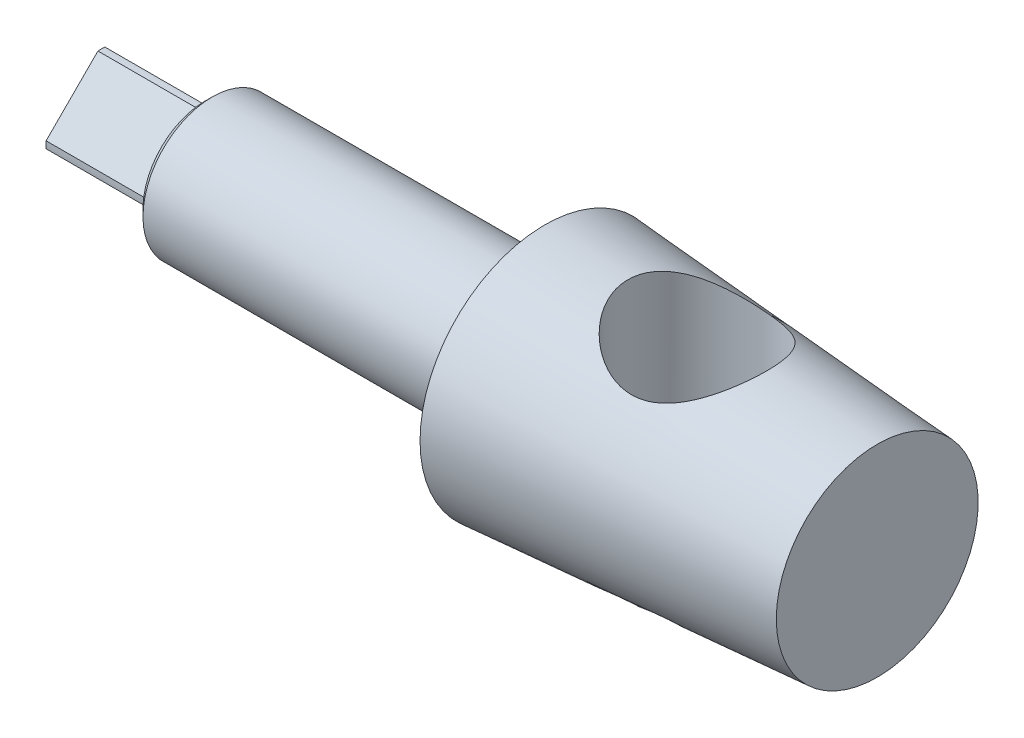
ISO-10303-21;
HEADER;
FILE_DESCRIPTION(('STEP AP214'),'2;1');
FILE_NAME('part.step','',(''),(''),'','','');
FILE_SCHEMA(('AUTOMOTIVE_DESIGN { 1 0 10303 214 1 1 1 1 }'));
ENDSEC;
DATA;
#1=APPLICATION_CONTEXT('core data for automotive mechanical design processes');
#2=APPLICATION_PROTOCOL_DEFINITION('international standard','automotive_design',2000,#1);
#3=PRODUCT_CONTEXT('',#1,'mechanical');
#4=PRODUCT('Part','Part','',(#3));
#5=PRODUCT_RELATED_PRODUCT_CATEGORY('part','',(#4));
#6=PRODUCT_DEFINITION_FORMATION('','',#4);
#7=PRODUCT_DEFINITION_CONTEXT('part definition',#1,'design');
#8=PRODUCT_DEFINITION('design','',#6,#7);
#9=PRODUCT_DEFINITION_SHAPE('','',#8);
#10=(LENGTH_UNIT() NAMED_UNIT(*) SI_UNIT(.MILLI.,.METRE.));
#11=(NAMED_UNIT(*) PLANE_ANGLE_UNIT() SI_UNIT($,.RADIAN.));
#12=(NAMED_UNIT(*) SI_UNIT($,.STERADIAN.) SOLID_ANGLE_UNIT());
#13=UNCERTAINTY_MEASURE_WITH_UNIT(LENGTH_MEASURE(1.E-05),#10,'distance_accuracy_value','');
#14=(GEOMETRIC_REPRESENTATION_CONTEXT(3) GLOBAL_UNCERTAINTY_ASSIGNED_CONTEXT((#13)) GLOBAL_UNIT_ASSIGNED_CONTEXT((#10,
#11,#12)) REPRESENTATION_CONTEXT('',''));
#15=CARTESIAN_POINT('',(0.,0.,0.));
#16=DIRECTION('',(0.,0.,1.));
#17=DIRECTION('',(1.,0.,0.));
#18=AXIS2_PLACEMENT_3D('',#15,#16,#17);
#19=CARTESIAN_POINT('',(-64.,0.,0.));
#20=DIRECTION('',(1.,0.,0.));
#21=DIRECTION('',(0.,0.,-1.));
#22=AXIS2_PLACEMENT_3D('',#19,#20,#21);
#23=PLANE('',#22);
#24=DIRECTION('',(0.,-0.707106781186547,-0.707106781186548));
#25=VECTOR('',#24,1.);
#26=CARTESIAN_POINT('',(-64.,0.,-8.48528137423857));
#27=LINE('',#26,#25);
#28=CARTESIAN_POINT('',(-64.,7.98429807389323,-0.500983300345341));
#29=VERTEX_POINT('',#28);
#30=CARTESIAN_POINT('',(-64.,0.500983300345344,-7.98429807389323));
#31=VERTEX_POINT('',#30);
#32=EDGE_CURVE('E166',#29,#31,#27,.T.);
#33=ORIENTED_EDGE('',*,*,#32,.T.);
#34=CARTESIAN_POINT('',(-64.,0.,0.));
#35=DIRECTION('',(-1.,0.,0.));
#36=DIRECTION('',(0.,0.,1.));
#37=AXIS2_PLACEMENT_3D('',#34,#35,#36);
#38=CIRCLE('',#37,8.);
#39=CARTESIAN_POINT('',(-64.,-0.500983300345339,-7.98429807389323));
#40=VERTEX_POINT('',#39);
#41=EDGE_CURVE('E186',#31,#40,#38,.T.);
#42=ORIENTED_EDGE('',*,*,#41,.T.);
#43=DIRECTION('',(0.,-0.707106781186548,0.707106781186547));
#44=VECTOR('',#43,1.);
#45=CARTESIAN_POINT('',(-64.,0.,-8.48528137423857));
#46=LINE('',#45,#44);
#47=CARTESIAN_POINT('',(-64.,-7.98429807389323,-0.500983300345344));
#48=VERTEX_POINT('',#47);
#49=EDGE_CURVE('E111',#40,#48,#46,.T.);
#50=ORIENTED_EDGE('',*,*,#49,.T.);
#51=CARTESIAN_POINT('',(-64.,-7.98429807389323,0.500983300345345));
#52=VERTEX_POINT('',#51);
#53=EDGE_CURVE('E130',#48,#52,#38,.T.);
#54=ORIENTED_EDGE('',*,*,#53,.T.);
#55=DIRECTION('',(0.,0.707106781186547,0.707106781186548));
#56=VECTOR('',#55,1.);
#57=CARTESIAN_POINT('',(-64.,-8.48528137423857,0.));
#58=LINE('',#57,#56);
#59=CARTESIAN_POINT('',(-64.,-0.500983300345346,7.98429807389323));
#60=VERTEX_POINT('',#59);
#61=EDGE_CURVE('E172',#52,#60,#58,.T.);
#62=ORIENTED_EDGE('',*,*,#61,.T.);
#63=CARTESIAN_POINT('',(-64.,0.500983300345345,7.98429807389323));
#64=VERTEX_POINT('',#63);
#65=EDGE_CURVE('E125',#60,#64,#38,.T.);
#66=ORIENTED_EDGE('',*,*,#65,.T.);
#67=DIRECTION('',(0.,0.707106781186548,-0.707106781186547));
#68=VECTOR('',#67,1.);
#69=CARTESIAN_POINT('',(-64.,8.48528137423857,0.));
#70=LINE('',#69,#68);
#71=CARTESIAN_POINT('',(-64.,7.98429807389323,0.500983300345347));
#72=VERTEX_POINT('',#71);
#73=EDGE_CURVE('E169',#64,#72,#70,.T.);
#74=ORIENTED_EDGE('',*,*,#73,.T.);
#75=EDGE_CURVE('E120',#72,#29,#38,.T.);
#76=ORIENTED_EDGE('',*,*,#75,.T.);
#77=EDGE_LOOP('',(#33,#42,#50,#54,#62,#66,#74,#76));
#78=FACE_BOUND('',#77,.T.);
#79=ADVANCED_FACE('F37',(#78),#23,.F.);
#80=CARTESIAN_POINT('',(-69.9935805331268,0.,0.));
#81=DIRECTION('',(-1.,0.,0.));
#82=DIRECTION('',(0.,0.,1.));
#83=AXIS2_PLACEMENT_3D('',#80,#81,#82);
#84=CYLINDRICAL_SURFACE('',#83,8.);
#85=DIRECTION('',(-1.,0.,0.));
#86=VECTOR('',#85,1.);
#87=CARTESIAN_POINT('',(-69.9935805331268,0.500983300345343,-7.98429807389323));
#88=LINE('',#87,#86);
#89=CARTESIAN_POINT('',(-49.,0.500983300345342,-7.98429807389323));
#90=VERTEX_POINT('',#89);
#91=EDGE_CURVE('E150',#90,#31,#88,.T.);
#92=ORIENTED_EDGE('',*,*,#91,.F.);
#93=CARTESIAN_POINT('',(-49.,0.,0.));
#94=DIRECTION('',(-1.,0.,0.));
#95=DIRECTION('',(0.,0.,1.));
#96=AXIS2_PLACEMENT_3D('',#93,#94,#95);
#97=CIRCLE('',#96,8.);
#98=CARTESIAN_POINT('',(-49.,-0.50098330034534,-7.98429807389323));
#99=VERTEX_POINT('',#98);
#100=EDGE_CURVE('E126',#90,#99,#97,.T.);
#101=ORIENTED_EDGE('',*,*,#100,.T.);
#102=DIRECTION('',(-1.,0.,0.));
#103=VECTOR('',#102,1.);
#104=CARTESIAN_POINT('',(-69.9935805331268,-0.500983300345337,-7.98429807389323));
#105=LINE('',#104,#103);
#106=EDGE_CURVE('E161',#40,#99,#105,.F.);
#107=ORIENTED_EDGE('',*,*,#106,.F.);
#108=ORIENTED_EDGE('',*,*,#41,.F.);
#109=EDGE_LOOP('',(#92,#101,#107,#108));
#110=FACE_BOUND('',#109,.T.);
#111=ADVANCED_FACE('F219',(#110),#84,.T.);
#112=DIRECTION('',(-1.,0.,0.));
#113=VECTOR('',#112,1.);
#114=CARTESIAN_POINT('',(-69.9935805331268,7.98429807389323,-0.500983300345341));
#115=LINE('',#114,#113);
#116=CARTESIAN_POINT('',(-49.,7.98429807389323,-0.500983300345341));
#117=VERTEX_POINT('',#116);
#118=EDGE_CURVE('E121',#29,#117,#115,.F.);
#119=ORIENTED_EDGE('',*,*,#118,.F.);
#120=ORIENTED_EDGE('',*,*,#75,.F.);
#121=DIRECTION('',(-1.,0.,0.));
#122=VECTOR('',#121,1.);
#123=CARTESIAN_POINT('',(-69.9935805331268,7.98429807389323,0.500983300345347));
#124=LINE('',#123,#122);
#125=CARTESIAN_POINT('',(-49.,7.98429807389323,0.500983300345346));
#126=VERTEX_POINT('',#125);
#127=EDGE_CURVE('E104',#126,#72,#124,.T.);
#128=ORIENTED_EDGE('',*,*,#127,.F.);
#129=EDGE_CURVE('E118',#126,#117,#97,.T.);
#130=ORIENTED_EDGE('',*,*,#129,.T.);
#131=EDGE_LOOP('',(#119,#120,#128,#130));
#132=FACE_BOUND('',#131,.T.);
#133=ADVANCED_FACE('F117',(#132),#84,.T.);
#134=DIRECTION('',(-1.,0.,0.));
#135=VECTOR('',#134,1.);
#136=CARTESIAN_POINT('',(-69.9935805331268,0.500983300345345,7.98429807389323));
#137=LINE('',#136,#135);
#138=CARTESIAN_POINT('',(-49.,0.500983300345344,7.98429807389323));
#139=VERTEX_POINT('',#138);
#140=EDGE_CURVE('E107',#64,#139,#137,.F.);
#141=ORIENTED_EDGE('',*,*,#140,.F.);
#142=ORIENTED_EDGE('',*,*,#65,.F.);
#143=DIRECTION('',(-1.,0.,0.));
#144=VECTOR('',#143,1.);
#145=CARTESIAN_POINT('',(-69.9935805331268,-0.500983300345343,7.98429807389323));
#146=LINE('',#145,#144);
#147=CARTESIAN_POINT('',(-49.,-0.500983300345344,7.98429807389323));
#148=VERTEX_POINT('',#147);
#149=EDGE_CURVE('E155',#148,#60,#146,.T.);
#150=ORIENTED_EDGE('',*,*,#149,.F.);
#151=EDGE_CURVE('E128',#148,#139,#97,.T.);
#152=ORIENTED_EDGE('',*,*,#151,.T.);
#153=EDGE_LOOP('',(#141,#142,#150,#152));
#154=FACE_BOUND('',#153,.T.);
#155=ADVANCED_FACE('F177',(#154),#84,.T.);
#156=DIRECTION('',(-1.,0.,0.));
#157=VECTOR('',#156,1.);
#158=CARTESIAN_POINT('',(-69.9935805331268,-7.98429807389323,0.500983300345343));
#159=LINE('',#158,#157);
#160=CARTESIAN_POINT('',(-49.,-7.98429807389323,0.500983300345345));
#161=VERTEX_POINT('',#160);
#162=EDGE_CURVE('E157',#52,#161,#159,.F.);
#163=ORIENTED_EDGE('',*,*,#162,.F.);
#164=ORIENTED_EDGE('',*,*,#53,.F.);
#165=DIRECTION('',(-1.,0.,0.));
#166=VECTOR('',#165,1.);
#167=CARTESIAN_POINT('',(-69.9935805331268,-7.98429807389323,-0.500983300345341));
#168=LINE('',#167,#166);
#169=CARTESIAN_POINT('',(-49.,-7.98429807389323,-0.500983300345342));
#170=VERTEX_POINT('',#169);
#171=EDGE_CURVE('E159',#170,#48,#168,.T.);
#172=ORIENTED_EDGE('',*,*,#171,.F.);
#173=EDGE_CURVE('E133',#170,#161,#97,.T.);
#174=ORIENTED_EDGE('',*,*,#173,.T.);
#175=EDGE_LOOP('',(#163,#164,#172,#174));
#176=FACE_BOUND('',#175,.T.);
#177=ADVANCED_FACE('F225',(#176),#84,.T.);
#178=CARTESIAN_POINT('',(-49.,8.,0.));
#179=DIRECTION('',(1.,0.,0.));
#180=DIRECTION('',(0.,0.,-1.));
#181=AXIS2_PLACEMENT_3D('',#178,#179,#180);
#182=PLANE('',#181);
#183=CARTESIAN_POINT('',(-49.,0.,0.));
#184=DIRECTION('',(1.,0.,0.));
#185=DIRECTION('',(0.,0.,-1.));
#186=AXIS2_PLACEMENT_3D('',#183,#184,#185);
#187=CIRCLE('',#186,9.00000000000001);
#188=CARTESIAN_POINT('',(-49.,0.,-9.00000000000001));
#189=VERTEX_POINT('',#188);
#190=EDGE_CURVE('E45',#189,#189,#187,.F.);
#191=ORIENTED_EDGE('',*,*,#190,.T.);
#192=EDGE_LOOP('',(#191));
#193=FACE_BOUND('',#192,.T.);
#194=ORIENTED_EDGE('',*,*,#100,.F.);
#195=DIRECTION('',(0.,-0.707106781186547,-0.707106781186548));
#196=VECTOR('',#195,1.);
#197=CARTESIAN_POINT('',(-49.,0.,-8.48528137423857));
#198=LINE('',#197,#196);
#199=EDGE_CURVE('E110',#117,#90,#198,.T.);
#200=ORIENTED_EDGE('',*,*,#199,.F.);
#201=ORIENTED_EDGE('',*,*,#129,.F.);
#202=DIRECTION('',(0.,0.707106781186548,-0.707106781186547));
#203=VECTOR('',#202,1.);
#204=CARTESIAN_POINT('',(-49.,8.48528137423857,0.));
#205=LINE('',#204,#203);
#206=EDGE_CURVE('E101',#139,#126,#205,.T.);
#207=ORIENTED_EDGE('',*,*,#206,.F.);
#208=ORIENTED_EDGE('',*,*,#151,.F.);
#209=DIRECTION('',(0.,0.707106781186548,0.707106781186548));
#210=VECTOR('',#209,1.);
#211=CARTESIAN_POINT('',(-49.,-8.48528137423857,0.));
#212=LINE('',#211,#210);
#213=EDGE_CURVE('E52',#161,#148,#212,.T.);
#214=ORIENTED_EDGE('',*,*,#213,.F.);
#215=ORIENTED_EDGE('',*,*,#173,.F.);
#216=DIRECTION('',(0.,-0.707106781186548,0.707106781186547));
#217=VECTOR('',#216,1.);
#218=CARTESIAN_POINT('',(-49.,0.,-8.48528137423857));
#219=LINE('',#218,#217);
#220=EDGE_CURVE('E58',#99,#170,#219,.T.);
#221=ORIENTED_EDGE('',*,*,#220,.F.);
#222=EDGE_LOOP('',(#194,#200,#201,#207,#208,#214,#215,#221));
#223=FACE_BOUND('',#222,.T.);
#224=ADVANCED_FACE('F123',(#193,#223),#182,.F.);
#225=CARTESIAN_POINT('',(-69.9935805331268,0.,0.));
#226=DIRECTION('',(-1.,0.,0.));
#227=DIRECTION('',(0.,0.,1.));
#228=AXIS2_PLACEMENT_3D('',#225,#226,#227);
#229=CYLINDRICAL_SURFACE('',#228,10.);
#230=CARTESIAN_POINT('',(-48.,0.,0.));
#231=DIRECTION('',(1.,0.,0.));
#232=DIRECTION('',(0.,0.,-1.));
#233=AXIS2_PLACEMENT_3D('',#230,#231,#232);
#234=CIRCLE('',#233,10.);
#235=CARTESIAN_POINT('',(-48.,0.,-10.));
#236=VERTEX_POINT('',#235);
#237=EDGE_CURVE('E12',#236,#236,#234,.T.);
#238=ORIENTED_EDGE('',*,*,#237,.T.);
#239=EDGE_LOOP('',(#238));
#240=FACE_BOUND('',#239,.T.);
#241=CARTESIAN_POINT('',(0.,0.,0.));
#242=DIRECTION('',(-1.,0.,0.));
#243=DIRECTION('',(0.,0.,1.));
#244=AXIS2_PLACEMENT_3D('',#241,#242,#243);
#245=CIRCLE('',#244,10.);
#246=CARTESIAN_POINT('',(0.,0.,10.));
#247=VERTEX_POINT('',#246);
#248=EDGE_CURVE('E135',#247,#247,#245,.T.);
#249=ORIENTED_EDGE('',*,*,#248,.T.);
#250=EDGE_LOOP('',(#249));
#251=FACE_BOUND('',#250,.T.);
#252=ADVANCED_FACE('F229',(#240,#251),#229,.T.);
#253=CARTESIAN_POINT('',(0.,10.,0.));
#254=DIRECTION('',(1.,0.,0.));
#255=DIRECTION('',(0.,0.,-1.));
#256=AXIS2_PLACEMENT_3D('',#253,#254,#255);
#257=PLANE('',#256);
#258=ORIENTED_EDGE('',*,*,#248,.F.);
#259=EDGE_LOOP('',(#258));
#260=FACE_BOUND('',#259,.T.);
#261=CARTESIAN_POINT('',(0.,0.,0.));
#262=DIRECTION('',(-1.,0.,0.));
#263=DIRECTION('',(0.,0.,1.));
#264=AXIS2_PLACEMENT_3D('',#261,#262,#263);
#265=CIRCLE('',#264,18.);
#266=CARTESIAN_POINT('',(0.,0.,18.));
#267=VERTEX_POINT('',#266);
#268=EDGE_CURVE('E140',#267,#267,#265,.T.);
#269=ORIENTED_EDGE('',*,*,#268,.T.);
#270=EDGE_LOOP('',(#269));
#271=FACE_BOUND('',#270,.T.);
#272=ADVANCED_FACE('F215',(#260,#271),#257,.F.);
#273=CARTESIAN_POINT('',(48.,0.,0.));
#274=DIRECTION('',(-1.,0.,0.));
#275=DIRECTION('',(0.,0.,1.));
#276=AXIS2_PLACEMENT_3D('',#273,#274,#275);
#277=CONICAL_SURFACE('',#276,14.5714285714289,0.0713074647852829);
#278=CARTESIAN_POINT('',(15.2980103573918,-15.1912129330623,-7.4218147935914));
#279=CARTESIAN_POINT('',(15.0956531993115,-15.2965748174476,-7.23908386618915));
#280=CARTESIAN_POINT('',(14.9005243458751,-15.4011346112845,-7.04786094383407));
#281=CARTESIAN_POINT('',(14.525688359926,-15.6065795129821,-6.64902643629856));
#282=CARTESIAN_POINT('',(14.3459808332944,-15.7074647147153,-6.44141527020893));
#283=CARTESIAN_POINT('',(14.0027379325853,-15.9037587315013,-6.00998609720935));
#284=CARTESIAN_POINT('',(13.8392365159726,-15.9991558788072,-5.78613569396557));
#285=CARTESIAN_POINT('',(13.5302069070274,-16.1822074237129,-5.32352622577979));
#286=CARTESIAN_POINT('',(13.3846691881525,-16.2698659182048,-5.08477516501451));
#287=CARTESIAN_POINT('',(13.1119546059566,-16.4361247003953,-4.59157874980465));
#288=CARTESIAN_POINT('',(12.9849135116824,-16.5146572290525,-4.33703516647278));
#289=CARTESIAN_POINT('',(12.751976679433,-16.6600252635254,-3.81519275646416));
#290=CARTESIAN_POINT('',(12.6460817931174,-16.7268602982134,-3.54789341658869));
#291=CARTESIAN_POINT('',(12.4571345284435,-16.8469589450248,-3.00279866902666));
#292=CARTESIAN_POINT('',(12.3740501719698,-16.9002415485272,-2.7250185825871));
#293=CARTESIAN_POINT('',(12.2319509046493,-16.9918091927125,-2.16096195099377));
#294=CARTESIAN_POINT('',(12.1729318497381,-17.0300968154981,-1.87468687779953));
#295=CARTESIAN_POINT('',(12.0856380430123,-17.0868802174249,-1.33111469621484));
#296=CARTESIAN_POINT('',(12.0545248494714,-17.1071990363657,-1.07446019786563));
#297=CARTESIAN_POINT('',(12.0122768000214,-17.1348136319657,-0.55881979123568));
#298=CARTESIAN_POINT('',(12.0011402539152,-17.1421105103933,-0.299834082059161));
#299=CARTESIAN_POINT('',(11.9990264007463,-17.143494656422,0.218187532211762));
#300=CARTESIAN_POINT('',(12.0080441737219,-17.1375851478939,0.477223409623876));
#301=CARTESIAN_POINT('',(12.0460814164004,-17.1127144138911,0.993182665546992));
#302=CARTESIAN_POINT('',(12.0751001997422,-17.093753636288,1.25010611624257));
#303=CARTESIAN_POINT('',(12.1492843584669,-17.0454670991561,1.73745741182321));
#304=CARTESIAN_POINT('',(12.192819558558,-17.0171903324493,1.96824073925726));
#305=CARTESIAN_POINT('',(12.2956358911478,-16.9507262544322,2.42489359360623));
#306=CARTESIAN_POINT('',(12.3549222401001,-16.9125356599641,2.65076146576395));
#307=CARTESIAN_POINT('',(12.488534818894,-16.826992389129,3.09613879042362));
#308=CARTESIAN_POINT('',(12.5628568793568,-16.7796422528473,3.31564998637391));
#309=CARTESIAN_POINT('',(12.7258126737237,-16.6766084801069,3.74736020186641));
#310=CARTESIAN_POINT('',(12.8144518781357,-16.6209216588406,3.95955638862467));
#311=CARTESIAN_POINT('',(13.0112599191234,-16.4984031739513,4.38882419847084));
#312=CARTESIAN_POINT('',(13.1203099938836,-16.4310890840547,4.60535371325547));
#313=CARTESIAN_POINT('',(13.3527304778889,-16.2892847954662,5.02821726073007));
#314=CARTESIAN_POINT('',(13.4761061194097,-16.2147919765124,5.2345475287666));
#315=CARTESIAN_POINT('',(13.7362336831301,-16.0598804214871,5.63626040334558));
#316=CARTESIAN_POINT('',(13.8729863213241,-15.9794613682748,5.83164242300942));
#317=CARTESIAN_POINT('',(14.1590267714168,-15.8139517692677,6.21092350506603));
#318=CARTESIAN_POINT('',(14.308315947471,-15.7288607154417,6.39482131400546));
#319=CARTESIAN_POINT('',(14.6423569679827,-15.5420348842188,6.77784173410317));
#320=CARTESIAN_POINT('',(14.8290443751703,-15.4397413809724,6.97500697044685));
#321=CARTESIAN_POINT('',(15.2170765294099,-15.2326207799813,7.35291186633719));
#322=CARTESIAN_POINT('',(15.4184227752476,-15.1277934238979,7.53364984202704));
#323=CARTESIAN_POINT('',(15.8352617794501,-14.9174883889471,7.87840526904642));
#324=CARTESIAN_POINT('',(16.0507765053774,-14.8120099414648,8.04239569877917));
#325=CARTESIAN_POINT('',(16.4949363358231,-14.602730303964,8.35270435227106));
#326=CARTESIAN_POINT('',(16.7235812759769,-14.4989290929706,8.49902279717773));
#327=CARTESIAN_POINT('',(17.2193733493616,-14.2840176958133,8.78845081516873));
#328=CARTESIAN_POINT('',(17.4879812191002,-14.1733698278128,8.92941349226032));
#329=CARTESIAN_POINT('',(18.0396976164262,-13.960352400777,9.18742326487725));
#330=CARTESIAN_POINT('',(18.3228087965933,-13.8579843649725,9.30446596589277));
#331=CARTESIAN_POINT('',(18.9015853406389,-13.6654377346484,9.51284430179756));
#332=CARTESIAN_POINT('',(19.1972205130446,-13.5752317989097,9.60423811525955));
#333=CARTESIAN_POINT('',(19.7997640509157,-13.4105653322726,9.75989978627841));
#334=CARTESIAN_POINT('',(20.1066664166662,-13.3360965601645,9.82418185931434));
#335=CARTESIAN_POINT('',(20.6388541393175,-13.2252640657587,9.90946123194595));
#336=CARTESIAN_POINT('',(20.8620214199694,-13.1841114670374,9.93760352662883));
#337=CARTESIAN_POINT('',(21.311443102431,-13.1126302334257,9.97881603527227));
#338=CARTESIAN_POINT('',(21.5376967559755,-13.082299021754,9.99188983898756));
#339=CARTESIAN_POINT('',(21.9916467453753,-13.0332842266043,10.0025714563892));
#340=CARTESIAN_POINT('',(22.2193417536501,-13.0145911607821,10.0001918790558));
#341=CARTESIAN_POINT('',(22.6747165460132,-12.9892288487289,9.97981462135863));
#342=CARTESIAN_POINT('',(22.9023963293284,-12.9825600082635,9.96181641396408));
#343=CARTESIAN_POINT('',(23.3560557341124,-12.9812141494413,9.91025932762101));
#344=CARTESIAN_POINT('',(23.5820350713178,-12.9865390932803,9.8766979032271));
#345=CARTESIAN_POINT('',(24.0306107619814,-13.0086973413665,9.7943160534358));
#346=CARTESIAN_POINT('',(24.2532070980483,-13.0255307047551,9.74549554962323));
#347=CARTESIAN_POINT('',(24.693664008669,-13.0698370446685,9.6330613181265));
#348=CARTESIAN_POINT('',(24.9115219164532,-13.0973158567253,9.56943948442916));
#349=CARTESIAN_POINT('',(25.341223280731,-13.1617494826834,9.42801238456329));
#350=CARTESIAN_POINT('',(25.5530642594143,-13.1987081393612,9.35020137033469));
#351=CARTESIAN_POINT('',(25.9746385221262,-13.2817208607156,9.17906521048467));
#352=CARTESIAN_POINT('',(26.1842000241427,-13.3279714353905,9.08541333587123));
#353=CARTESIAN_POINT('',(26.595124515826,-13.4274494990951,8.8846579114228));
#354=CARTESIAN_POINT('',(26.7964847868755,-13.4806792773765,8.77754994833432));
#355=CARTESIAN_POINT('',(27.1903290881653,-13.5925596514647,8.55056445072725));
#356=CARTESIAN_POINT('',(27.3828118390338,-13.6512110249611,8.43068508386352));
#357=CARTESIAN_POINT('',(27.7583625647536,-13.7724209397447,8.17877706593204));
#358=CARTESIAN_POINT('',(27.9414299142885,-13.8349797399311,8.04674760954598));
#359=CARTESIAN_POINT('',(28.3313346519812,-13.9746087346649,7.74505583660926));
#360=CARTESIAN_POINT('',(28.5361376367106,-14.0521894131756,7.57299378741918));
#361=CARTESIAN_POINT('',(28.9310271925555,-14.2085337168486,7.21333339216));
#362=CARTESIAN_POINT('',(29.1211165475132,-14.2872971148547,7.0257379989947));
#363=CARTESIAN_POINT('',(29.486073007778,-14.44397655433,6.63552158290185));
#364=CARTESIAN_POINT('',(29.6609231647878,-14.521891570112,6.43288428323817));
#365=CARTESIAN_POINT('',(29.994244794614,-14.6747368164691,6.01362993446565));
#366=CARTESIAN_POINT('',(30.1527221939742,-14.749668120997,5.7970179902896));
#367=CARTESIAN_POINT('',(30.4662784530378,-14.901376623836,5.3299507022013));
#368=CARTESIAN_POINT('',(30.6196891817361,-14.9776842465606,5.0782178105209));
#369=CARTESIAN_POINT('',(30.9045316339786,-15.1221568391553,4.56033419697584));
#370=CARTESIAN_POINT('',(31.0359616222448,-15.1903211660284,4.29418233899423));
#371=CARTESIAN_POINT('',(31.2752702141037,-15.3162861268074,3.74937339094771));
#372=CARTESIAN_POINT('',(31.3831676850806,-15.3740950565415,3.47072653657073));
#373=CARTESIAN_POINT('',(31.5740893009075,-15.4774842437146,2.90284448592311));
#374=CARTESIAN_POINT('',(31.6571172593491,-15.523066375948,2.61361092070268));
#375=CARTESIAN_POINT('',(31.7903061853179,-15.5967000171803,2.05528161801027));
#376=CARTESIAN_POINT('',(31.842858823886,-15.6260152241983,1.78692162930871));
#377=CARTESIAN_POINT('',(31.9258747632497,-15.6724917937995,1.24576239039784));
#378=CARTESIAN_POINT('',(31.9563394270255,-15.6896539063107,0.972963415166864));
#379=CARTESIAN_POINT('',(31.9947137502689,-15.7112919139428,0.425420344495721));
#380=CARTESIAN_POINT('',(32.0026348115191,-15.7157742220677,0.150677302812292));
#381=CARTESIAN_POINT('',(31.9958306002248,-15.7119302894951,-0.398429551940886));
#382=CARTESIAN_POINT('',(31.9811067438826,-15.7036048497881,-0.672793387651962));
#383=CARTESIAN_POINT('',(31.9318405837012,-15.6758701802544,-1.19141510659526));
#384=CARTESIAN_POINT('',(31.8994247442635,-15.6576511170776,-1.43594279272369));
#385=CARTESIAN_POINT('',(31.8168313878232,-15.6115065424355,-1.921026694062));
#386=CARTESIAN_POINT('',(31.7666553549586,-15.5835818420295,-2.16158323936442));
#387=CARTESIAN_POINT('',(31.6491022943962,-15.5186948848098,-2.63720357709925));
#388=CARTESIAN_POINT('',(31.5817247963065,-15.4817323808494,-2.87226721913064));
#389=CARTESIAN_POINT('',(31.4304562814489,-15.3996247013892,-3.3355480702781));
#390=CARTESIAN_POINT('',(31.3465644527031,-15.3544791235521,-3.5637649421155));
#391=CARTESIAN_POINT('',(31.1600943291091,-15.2554488445861,-4.01935057432748));
#392=CARTESIAN_POINT('',(31.0570042511948,-15.2013308429725,-4.24645882423284));
#393=CARTESIAN_POINT('',(30.8348780470406,-15.0866576467649,-4.69113301250013));
#394=CARTESIAN_POINT('',(30.715836224104,-15.0261001540984,-4.90869550485912));
#395=CARTESIAN_POINT('',(30.4626353506911,-14.8998700382129,-5.33338018162571));
#396=CARTESIAN_POINT('',(30.3284710067971,-14.8341956263902,-5.54049867331643));
#397=CARTESIAN_POINT('',(30.0458453901143,-14.6991582001458,-5.94347984180841));
#398=CARTESIAN_POINT('',(29.8973828450337,-14.6297948577195,-6.13934151446745));
#399=CARTESIAN_POINT('',(29.5678457618813,-14.4802244350922,-6.542441013002));
#400=CARTESIAN_POINT('',(29.3850043969114,-14.399730331327,-6.7481305870249));
#401=CARTESIAN_POINT('',(29.0031152934919,-14.2381810305257,-7.14366597703873));
#402=CARTESIAN_POINT('',(28.8040657310343,-14.1571257712812,-7.33351000495138));
#403=CARTESIAN_POINT('',(28.3905594675632,-13.9968130586218,-7.69652212643103));
#404=CARTESIAN_POINT('',(28.1761004346298,-13.9175558797089,-7.86968768672118));
#405=CARTESIAN_POINT('',(27.7325827259426,-13.7633802600821,-8.19839450692542));
#406=CARTESIAN_POINT('',(27.5035243582589,-13.6884617278793,-8.35393613854122));
#407=CARTESIAN_POINT('',(27.0582488336101,-13.5537061496521,-8.62987741605967));
#408=CARTESIAN_POINT('',(26.8434876319857,-13.4931206963068,-8.75226196721571));
#409=CARTESIAN_POINT('',(26.4039869457183,-13.379493885903,-8.98144080349491));
#410=CARTESIAN_POINT('',(26.1792522428496,-13.3264489637488,-9.0882424567076));
#411=CARTESIAN_POINT('',(25.7208769015482,-13.2299074711003,-9.28532441431687));
#412=CARTESIAN_POINT('',(25.4872440645305,-13.1864027525844,-9.3756188060536));
#413=CARTESIAN_POINT('',(25.012172767957,-13.1107893348441,-9.53886191211694));
#414=CARTESIAN_POINT('',(24.7707344169124,-13.0786804772704,-9.6118108674597));
#415=CARTESIAN_POINT('',(24.2798353792629,-13.0273241381194,-9.73997841021857));
#416=CARTESIAN_POINT('',(24.0303275164309,-13.0081767246157,-9.79505737421414));
#417=CARTESIAN_POINT('',(23.5271371122842,-12.9843925433393,-9.88601082382227));
#418=CARTESIAN_POINT('',(23.2734546228485,-12.9797555953789,-9.92188554790424));
#419=CARTESIAN_POINT('',(22.7643434613585,-12.9856149954488,-9.97402807713067));
#420=CARTESIAN_POINT('',(22.5089154332558,-12.9961060339338,-9.99030275772216));
#421=CARTESIAN_POINT('',(21.9986413643039,-13.0321162564617,-10.0032558574463));
#422=CARTESIAN_POINT('',(21.7437952881289,-13.0576345025873,-9.99993549947897));
#423=CARTESIAN_POINT('',(21.2671230332708,-13.1190126514395,-9.97561507732947));
#424=CARTESIAN_POINT('',(21.0449753642141,-13.1532811260645,-9.95676525059991));
#425=CARTESIAN_POINT('',(20.6041430115456,-13.231969086972,-9.90458806672356));
#426=CARTESIAN_POINT('',(20.3854595055276,-13.2763919491407,-9.8712558915071));
#427=CARTESIAN_POINT('',(19.95265322296,-13.3742763532768,-9.79065097480608));
#428=CARTESIAN_POINT('',(19.7385323244273,-13.4277415392205,-9.7433726073909));
#429=CARTESIAN_POINT('',(19.3157707976156,-13.5424465462246,-9.63548397444312));
#430=CARTESIAN_POINT('',(19.1071322454962,-13.6036892628415,-9.57486873743654));
#431=CARTESIAN_POINT('',(18.4494360660781,-13.8100143844269,-9.36052983972929));
#432=CARTESIAN_POINT('',(18.0120434216955,-13.967580782607,-9.1823073850876));
#433=CARTESIAN_POINT('',(17.1726000144702,-14.3003698907179,-8.77011552520598));
#434=CARTESIAN_POINT('',(16.7705172698066,-14.4755763079082,-8.5361972941887));
#435=CARTESIAN_POINT('',(16.1962182405646,-14.7426614924817,-8.14675006068756));
#436=CARTESIAN_POINT('',(16.0096197945117,-14.8323862724383,-8.01053343610467));
#437=CARTESIAN_POINT('',(15.6462852747254,-15.0120037951757,-7.72551817613341));
#438=CARTESIAN_POINT('',(15.4695506390654,-15.1018965604833,-7.57671771402397));
#439=CARTESIAN_POINT('',(15.2980103573918,-15.1912129330623,-7.4218147935914));
#440=B_SPLINE_CURVE_WITH_KNOTS('',3,(#278,#279,#280,#281,#282,#283,#284,#285,#286,#287,#288,
#289,#290,#291,#292,#293,#294,#295,#296,#297,#298,#299,#300,#301,#302,#303,#304,#305,#306,#307,
#308,#309,#310,#311,#312,#313,#314,#315,#316,#317,#318,#319,#320,#321,#322,#323,#324,#325,#326,
#327,#328,#329,#330,#331,#332,#333,#334,#335,#336,#337,#338,#339,#340,#341,#342,#343,#344,#345,
#346,#347,#348,#349,#350,#351,#352,#353,#354,#355,#356,#357,#358,#359,#360,#361,#362,#363,#364,
#365,#366,#367,#368,#369,#370,#371,#372,#373,#374,#375,#376,#377,#378,#379,#380,#381,#382,#383,
#384,#385,#386,#387,#388,#389,#390,#391,#392,#393,#394,#395,#396,#397,#398,#399,#400,#401,#402,
#403,#404,#405,#406,#407,#408,#409,#410,#411,#412,#413,#414,#415,#416,#417,#418,#419,#420,#421,
#422,#423,#424,#425,#426,#427,#428,#429,#430,#431,#432,#433,#434,#435,#436,#437,#438,#439),
.UNSPECIFIED.,.T.,.F.,(4,2,2,2,2,2,2,2,2,2,2,2,2,2,2,2,2,2,2,2,2,2,2,2,2,2,2,2,2,2,2,2,2,2,2,2,
2,2,2,2,2,2,2,2,2,2,2,2,2,2,2,2,2,2,2,2,2,2,2,2,2,2,2,2,2,2,2,2,2,2,2,2,2,2,2,2,2,2,2,2,4),(0.,
0.876709766581773,1.75339712063072,2.63188424136379,3.50990346097991,4.39407362333302,
5.27827938829317,6.1612391797487,7.04404686054208,7.82097086797016,8.59782913780851,
9.37449778598813,10.1511397830798,10.8600022700123,11.5690998107601,12.278000988744,
12.9871736778216,13.7412523675526,14.4956073487981,15.2500027284803,16.0044803038551,
16.8740597090964,17.7437281492523,18.6147783082393,19.4858175657607,20.4532470034679,
21.4208540150978,22.3862481598875,23.3511354890867,24.0364407262408,24.7215826699007,
25.4061656514033,26.0907717341873,26.7754898273837,27.4602114393488,28.1453089285367,
28.8306845708755,29.5324632235091,30.2344726454567,30.9365829224325,31.6387397694409,
32.4734122700118,33.3079264612195,34.1433572208549,34.9784845072694,35.8908047350129,
36.803196952262,37.7148549404655,38.6263730596997,39.4502978537818,40.2741718017028,
41.0976289882671,41.9210346783027,42.6621945393261,43.4032924796312,44.1444106881954,
44.8855653452268,45.6504214474439,46.4155514271203,47.1809500660033,47.9464168751206,
48.805709410929,49.6650987822038,50.5246184801547,51.3841200468224,52.1468927890798,
52.9093036911417,53.6710608811303,54.4328074858261,55.2003700109552,55.967923004625,
56.7352066719278,57.5024424545936,58.1784048935813,58.8545923879782,59.5310530320977,
60.2077662633213,61.6958286175827,63.1825289555734,63.9256169487945,64.6688129974652),.UNSPECIFIED.);
#441=CARTESIAN_POINT('',(15.2980103573918,-15.1912129330623,-7.4218147935914));
#442=VERTEX_POINT('',#441);
#443=EDGE_CURVE('E149',#442,#442,#440,.T.);
#444=ORIENTED_EDGE('',*,*,#443,.T.);
#445=EDGE_LOOP('',(#444));
#446=FACE_BOUND('',#445,.T.);
#447=CARTESIAN_POINT('',(15.2980103573918,15.1912129330623,-7.4218147935914));
#448=CARTESIAN_POINT('',(15.5083131420007,15.081713945223,-7.61172072578937));
#449=CARTESIAN_POINT('',(15.7264284142631,14.9713445922863,-7.7924623890528));
#450=CARTESIAN_POINT('',(16.1774015343926,14.7512667447458,-8.13495642535038));
#451=CARTESIAN_POINT('',(16.4102590612951,14.641558235811,-8.29670921158679));
#452=CARTESIAN_POINT('',(16.8902955529644,14.4251912693653,-8.6006831499538));
#453=CARTESIAN_POINT('',(17.1374949938061,14.3185375143863,-8.74287534851454));
#454=CARTESIAN_POINT('',(17.645101124896,14.1112216880176,-9.00647578617368));
#455=CARTESIAN_POINT('',(17.9055045607737,14.0105581533935,-9.12788911464462));
#456=CARTESIAN_POINT('',(18.3963985927392,13.833422206311,-9.3312927152934));
#457=CARTESIAN_POINT('',(18.6250948858336,13.7556434531009,-9.41648124975522));
#458=CARTESIAN_POINT('',(19.0904835404561,13.6083035640735,-9.57051549780548));
#459=CARTESIAN_POINT('',(19.3271742652837,13.5387407591619,-9.63936453369004));
#460=CARTESIAN_POINT('',(19.8073412296992,13.4097943563982,-9.75978649504846));
#461=CARTESIAN_POINT('',(20.0508093151523,13.3503990928387,-9.81137928518369));
#462=CARTESIAN_POINT('',(20.5433506431773,13.2435355841056,-9.89649359964677));
#463=CARTESIAN_POINT('',(20.7924208128016,13.1960609658729,-9.93002479116134));
#464=CARTESIAN_POINT('',(21.296718595477,13.1142259233995,-9.97848133383026));
#465=CARTESIAN_POINT('',(21.5519805291081,13.0799802381792,-9.99324633540934));
#466=CARTESIAN_POINT('',(22.0644553601071,13.0263429764406,-10.0030752906691));
#467=CARTESIAN_POINT('',(22.3216682341159,13.0069512223538,-9.99813947986383));
#468=CARTESIAN_POINT('',(22.8356010785328,12.983544378342,-9.96835064082291));
#469=CARTESIAN_POINT('',(23.0923211213738,12.9795268229205,-9.9435008068895));
#470=CARTESIAN_POINT('',(23.6028470825389,12.9866442424285,-9.8740688814844));
#471=CARTESIAN_POINT('',(23.8566531873626,12.9977782421054,-9.82948806015175));
#472=CARTESIAN_POINT('',(24.3277438865733,13.0319804752732,-9.72791047215142));
#473=CARTESIAN_POINT('',(24.5456392780473,13.0533891748698,-9.67315233083861));
#474=CARTESIAN_POINT('',(24.976212142578,13.1061091185042,-9.54946863755966));
#475=CARTESIAN_POINT('',(25.1888878730832,13.1374236223505,-9.48053842445659));
#476=CARTESIAN_POINT('',(25.6078542414747,13.2087365768028,-9.32914782035451));
#477=CARTESIAN_POINT('',(25.8141449789376,13.2487348919029,-9.24668764048783));
#478=CARTESIAN_POINT('',(26.2195259452535,13.3360713453111,-9.06888309903736));
#479=CARTESIAN_POINT('',(26.4186134522416,13.3834122231378,-8.97353393026984));
#480=CARTESIAN_POINT('',(27.0414395496821,13.5440093760343,-8.64963025531742));
#481=CARTESIAN_POINT('',(27.4503492092808,13.6686212829648,-8.39767410598235));
#482=CARTESIAN_POINT('',(28.2251516432003,13.9321265606769,-7.84063492915428));
#483=CARTESIAN_POINT('',(28.5910142844922,14.0710298094378,-7.53551505322464));
#484=CARTESIAN_POINT('',(29.1360065442101,14.293293781119,-7.0111784808772));
#485=CARTESIAN_POINT('',(29.3305265362772,14.3762484422328,-6.80754957726593));
#486=CARTESIAN_POINT('',(29.7021075039792,14.5402440678111,-6.38411119040634));
#487=CARTESIAN_POINT('',(29.8791665672299,14.6212848219201,-6.16429993940317));
#488=CARTESIAN_POINT('',(30.2147773280092,14.7791466399007,-5.70940924974804));
#489=CARTESIAN_POINT('',(30.3733220520991,14.8559661080914,-5.47432410972982));
#490=CARTESIAN_POINT('',(30.6706375518367,15.0031742286862,-4.99006507567356));
#491=CARTESIAN_POINT('',(30.8094104211216,15.0735635616922,-4.74089267724084));
#492=CARTESIAN_POINT('',(31.0680452221461,15.2069796230622,-4.22552253737534));
#493=CARTESIAN_POINT('',(31.1875553312533,15.2698648755898,-3.95911096349185));
#494=CARTESIAN_POINT('',(31.4034465233284,15.3849340159047,-3.41480590898672));
#495=CARTESIAN_POINT('',(31.4998269106683,15.4371175818311,-3.13691208333011));
#496=CARTESIAN_POINT('',(31.668047181816,15.52902695689,-2.57208107479646));
#497=CARTESIAN_POINT('',(31.7399119787753,15.5687654095668,-2.28515339820305));
#498=CARTESIAN_POINT('',(31.8581049138508,15.6344878619062,-1.7045500855584));
#499=CARTESIAN_POINT('',(31.9044370842442,15.6604740333921,-1.41087552265441));
#500=CARTESIAN_POINT('',(31.9667141489229,15.6954875441528,-0.855989058231833));
#501=CARTESIAN_POINT('',(31.9856920237607,15.7062056190078,-0.595219525934015));
#502=CARTESIAN_POINT('',(32.0031490453782,15.7160630974087,-0.0727869979992271));
#503=CARTESIAN_POINT('',(32.0016300482259,15.7152035493514,0.188875914593578));
#504=CARTESIAN_POINT('',(31.9781182014693,15.7019314327269,0.710935109789733));
#505=CARTESIAN_POINT('',(31.9561287246604,15.6895207673666,0.971331593950123));
#506=CARTESIAN_POINT('',(31.8919836304488,15.6534964507218,1.48883830649041));
#507=CARTESIAN_POINT('',(31.8498281459582,15.6298828732748,1.74594855651809));
#508=CARTESIAN_POINT('',(31.7489482244873,15.5737926063688,2.240051155838));
#509=CARTESIAN_POINT('',(31.6913370846157,15.5419150836099,2.47734062408309));
#510=CARTESIAN_POINT('',(31.5593529950523,15.4695551141304,2.94584399905778));
#511=CARTESIAN_POINT('',(31.484980949061,15.4290731313445,3.17705823259654));
#512=CARTESIAN_POINT('',(31.3202011984569,15.3404206829356,3.63213587577558));
#513=CARTESIAN_POINT('',(31.2297953151731,15.2922510906321,3.856000116903));
#514=CARTESIAN_POINT('',(31.0336773116741,15.1892444974882,4.29541495176047));
#515=CARTESIAN_POINT('',(30.9279595926829,15.1344050589977,4.51096246781036));
#516=CARTESIAN_POINT('',(30.6935018379023,15.0148730027589,4.94865812157727));
#517=CARTESIAN_POINT('',(30.5636276177244,14.9497493777749,5.17008099240977));
#518=CARTESIAN_POINT('',(30.2879709771551,14.814620775971,5.60134532067702));
#519=CARTESIAN_POINT('',(30.1421816693614,14.744613690557,5.81118170432811));
#520=CARTESIAN_POINT('',(29.8354719014939,14.6012987611414,6.21855588281306));
#521=CARTESIAN_POINT('',(29.6745398958926,14.5279884211372,6.41608409942674));
#522=CARTESIAN_POINT('',(29.3384026830595,14.3798186301193,6.79798246323336));
#523=CARTESIAN_POINT('',(29.1631965726763,14.3049590813081,6.98235177644931));
#524=CARTESIAN_POINT('',(28.776728751467,14.1462634608313,7.35917761511333));
#525=CARTESIAN_POINT('',(28.5636855389772,14.0624593471834,7.54982566086555));
#526=CARTESIAN_POINT('',(28.1213176137745,13.8978742708673,7.91273218112404));
#527=CARTESIAN_POINT('',(27.8919904590865,13.8170937644114,8.08498788773688));
#528=CARTESIAN_POINT('',(27.4181455219867,13.6615391726375,8.40988477414593));
#529=CARTESIAN_POINT('',(27.1736384742849,13.5867609266246,8.56253958584211));
#530=CARTESIAN_POINT('',(26.6703824342035,13.4462627218454,8.84709143785945));
#531=CARTESIAN_POINT('',(26.4116376479542,13.3805401077445,8.97899456470226));
#532=CARTESIAN_POINT('',(25.9351475006836,13.273438249967,9.19611670021478));
#533=CARTESIAN_POINT('',(25.7197392366843,13.2298255691808,9.28537727115443));
#534=CARTESIAN_POINT('',(25.2818170070559,13.1519728916057,9.44903518848029));
#535=CARTESIAN_POINT('',(25.0593074014909,13.1177272627403,9.52344145892819));
#536=CARTESIAN_POINT('',(24.6085131967464,13.0600470897349,9.65664742848413));
#537=CARTESIAN_POINT('',(24.3802344187463,13.0366020736217,9.71546222105859));
#538=CARTESIAN_POINT('',(23.919196856152,13.0016439094797,9.81694394695992));
#539=CARTESIAN_POINT('',(23.686438058076,12.9901307973633,9.8596108316849));
#540=CARTESIAN_POINT('',(23.2173156347313,12.9797898147399,9.928471825378));
#541=CARTESIAN_POINT('',(22.9809417749025,12.9810096045948,9.95460365504714));
#542=CARTESIAN_POINT('',(22.5073601699577,12.9965244121448,9.98994340225547));
#543=CARTESIAN_POINT('',(22.2701524229137,13.0108194600879,9.99915128064308));
#544=CARTESIAN_POINT('',(21.7966928312062,13.0522303299436,10.0007370123206));
#545=CARTESIAN_POINT('',(21.5604415326852,13.0793526539444,9.9931063230175));
#546=CARTESIAN_POINT('',(21.0907765331318,13.1456611381271,9.96136152993366));
#547=CARTESIAN_POINT('',(20.8573628519864,13.1848473828066,9.93724731069836));
#548=CARTESIAN_POINT('',(20.4057400959767,13.2720459775628,9.87460558006251));
#549=CARTESIAN_POINT('',(20.1873318773706,13.3195571948367,9.83680841959377));
#550=CARTESIAN_POINT('',(19.7554693003468,13.4233049827384,9.7473468533137));
#551=CARTESIAN_POINT('',(19.542016668122,13.479544542827,9.69567769189465));
#552=CARTESIAN_POINT('',(18.910378019931,13.6594282193416,9.52076233173308));
#553=CARTESIAN_POINT('',(18.5006704660599,13.7942861678957,9.37757385960427));
#554=CARTESIAN_POINT('',(17.8743683391936,14.0228973444027,9.11274209379253));
#555=CARTESIAN_POINT('',(17.6484352969377,14.1103668689454,9.00697777809058));
#556=CARTESIAN_POINT('',(17.2064986387254,14.2899251267278,8.77975229446917));
#557=CARTESIAN_POINT('',(16.9904957985695,14.3820142197016,8.65828990294781));
#558=CARTESIAN_POINT('',(16.3577660435317,14.6626393580306,8.27102437652695));
#559=CARTESIAN_POINT('',(15.9565021230166,14.8554633734494,7.98242143617934));
#560=CARTESIAN_POINT('',(15.3536828762187,15.1610578623343,7.47747330368748));
#561=CARTESIAN_POINT('',(15.1370375143256,15.2746374762296,7.27916911431264));
#562=CARTESIAN_POINT('',(14.7210785171848,15.4984898013714,6.86321815954254));
#563=CARTESIAN_POINT('',(14.5217677600948,15.6087619614797,6.64556819414803));
#564=CARTESIAN_POINT('',(14.1420187385826,15.8233487966436,6.19189867052868));
#565=CARTESIAN_POINT('',(13.9615698794057,15.9276668010443,5.9558895560321));
#566=CARTESIAN_POINT('',(13.6209759482234,16.1279306068136,5.46633433088661));
#567=CARTESIAN_POINT('',(13.4608260501325,16.2238783965064,5.21279241090783));
#568=CARTESIAN_POINT('',(13.189157757531,16.3888357991198,4.73606747592441));
#569=CARTESIAN_POINT('',(13.0740587301079,16.4595990337748,4.51552509631106));
#570=CARTESIAN_POINT('',(12.8597941254731,16.5925268421634,4.06435411990019));
#571=CARTESIAN_POINT('',(12.7606256819164,16.6546929624709,3.83372734708067));
#572=CARTESIAN_POINT('',(12.5793162220504,16.7691630674393,3.36364938905688));
#573=CARTESIAN_POINT('',(12.4971652510661,16.8214728161327,3.12420345988573));
#574=CARTESIAN_POINT('',(12.3508217621025,16.9151551798055,2.63777524123156));
#575=CARTESIAN_POINT('',(12.2866294731076,16.9565276553275,2.39079285569851));
#576=CARTESIAN_POINT('',(12.1768064048162,17.0275678522723,1.88970524179761));
#577=CARTESIAN_POINT('',(12.1312729387203,17.0571741849919,1.63556987688107));
#578=CARTESIAN_POINT('',(12.0599363409701,17.1036519931164,1.12338104674618));
#579=CARTESIAN_POINT('',(12.0341332692028,17.1205234298676,0.865327569637733));
#580=CARTESIAN_POINT('',(12.0026762274618,17.1411007971333,0.347530599968755));
#581=CARTESIAN_POINT('',(11.9970174844505,17.1448098463696,0.0877875223599745));
#582=CARTESIAN_POINT('',(12.0059308757058,17.1389740385095,-0.431190659514991));
#583=CARTESIAN_POINT('',(12.0205017145385,17.129430030094,-0.690425795243542));
#584=CARTESIAN_POINT('',(12.0675255324436,17.0987125518616,-1.18409496907448));
#585=CARTESIAN_POINT('',(12.0983426373186,17.0786034530538,-1.41875401057307));
#586=CARTESIAN_POINT('',(12.1762816588383,17.0279345849029,-1.88420728836027));
#587=CARTESIAN_POINT('',(12.2234041094752,16.9973744732946,-2.11500139781468));
#588=CARTESIAN_POINT('',(12.3333844142904,16.926409673434,-2.57131138525752));
#589=CARTESIAN_POINT('',(12.3962461503784,16.8860025565993,-2.79682594608058));
#590=CARTESIAN_POINT('',(12.5369875419538,16.7961185831793,-3.2412550876022));
#591=CARTESIAN_POINT('',(12.6148677076428,16.7466414184716,-3.46016944378827));
#592=CARTESIAN_POINT('',(12.7880343075664,16.6375005662243,-3.8983644732519));
#593=CARTESIAN_POINT('',(12.8838625151716,16.577525269253,-4.11735303247817));
#594=CARTESIAN_POINT('',(13.0899513406717,16.4498241329359,-4.54616894828828));
#595=CARTESIAN_POINT('',(13.2002174466211,16.3820953476135,-4.75599278057576));
#596=CARTESIAN_POINT('',(13.4341473618512,16.2401039331465,-5.16543425680181));
#597=CARTESIAN_POINT('',(13.5577989114221,16.1658472943759,-5.36506099762958));
#598=CARTESIAN_POINT('',(13.817741868288,16.0119046710196,-5.75372291237003));
#599=CARTESIAN_POINT('',(13.9540351199661,15.9322178946458,-5.94275653430707));
#600=CARTESIAN_POINT('',(14.278086656089,15.7458146290601,-6.36082788684447));
#601=CARTESIAN_POINT('',(14.4696112092433,15.6377478781106,-6.5863568259636));
#602=CARTESIAN_POINT('',(14.8706303091587,15.4171702308408,-7.01847618571121));
#603=CARTESIAN_POINT('',(15.0801274213513,15.3046587013067,-7.22506389390291));
#604=CARTESIAN_POINT('',(15.2980103573918,15.1912129330623,-7.4218147935914));
#605=B_SPLINE_CURVE_WITH_KNOTS('',3,(#447,#448,#449,#450,#451,#452,#453,#454,#455,#456,#457,
#458,#459,#460,#461,#462,#463,#464,#465,#466,#467,#468,#469,#470,#471,#472,#473,#474,#475,#476,
#477,#478,#479,#480,#481,#482,#483,#484,#485,#486,#487,#488,#489,#490,#491,#492,#493,#494,#495,
#496,#497,#498,#499,#500,#501,#502,#503,#504,#505,#506,#507,#508,#509,#510,#511,#512,#513,#514,
#515,#516,#517,#518,#519,#520,#521,#522,#523,#524,#525,#526,#527,#528,#529,#530,#531,#532,#533,
#534,#535,#536,#537,#538,#539,#540,#541,#542,#543,#544,#545,#546,#547,#548,#549,#550,#551,#552,
#553,#554,#555,#556,#557,#558,#559,#560,#561,#562,#563,#564,#565,#566,#567,#568,#569,#570,#571,
#572,#573,#574,#575,#576,#577,#578,#579,#580,#581,#582,#583,#584,#585,#586,#587,#588,#589,#590,
#591,#592,#593,#594,#595,#596,#597,#598,#599,#600,#601,#602,#603,#604),.UNSPECIFIED.,.T.,.F.,(4,
2,2,2,2,2,2,2,2,2,2,2,2,2,2,2,2,2,2,2,2,2,2,2,2,2,2,2,2,2,2,2,2,2,2,2,2,2,2,2,2,2,2,2,2,2,2,2,2,
2,2,2,2,2,2,2,2,2,2,2,2,2,2,2,2,2,2,2,2,2,2,2,2,2,2,2,2,2,4),(0.,0.911090468851446,
1.82216110849188,2.73456612816061,3.64674735147105,4.41445938888067,5.18201519406959,
5.94868435570657,6.71494276095026,7.48770546362006,8.26045892829999,9.03308846452317,
9.80566827164671,10.482001903461,11.158558335529,11.8351042110787,12.511903116579,
13.9947329761314,15.478594721773,16.3584554699348,17.238412476855,18.1186998584126,
18.9988939571529,19.8936865825696,20.7885061155654,21.6824135901501,22.5761798526105,
23.3601866919981,24.1441225371245,24.9279292408064,25.7117307785653,26.4496891574041,
27.1876077571403,27.9254425882328,28.6635478930969,29.4572359488551,30.2512688524383,
31.0459121481582,31.8406057616601,32.7333421963593,33.6262127916374,34.5184590164294,
35.4104430532892,36.1213910120492,36.831910558606,37.5417397477501,38.2515710733183,
38.9640603092691,39.6765511934778,40.3894036238106,41.1022610471819,41.7816287929163,
42.4612297379633,43.8196943187232,44.6121733123644,45.4047141138529,46.9904265516474,
47.9342466810299,48.8782232199714,49.8216666439598,50.7648853415056,51.5400333496197,
52.3150417309482,53.0895954689917,53.8641590826329,54.6427124598685,55.4212682002139,
56.1996394557214,56.9779608692679,57.6897191944918,58.4015008316612,59.1134581946354,
59.8254397482824,60.5640318679923,61.3029055567489,62.0411081479778,62.7794186104737,
63.7232134712941,64.6671432757472),.UNSPECIFIED.);
#606=CARTESIAN_POINT('',(15.2980103573918,15.1912129330623,-7.4218147935914));
#607=VERTEX_POINT('',#606);
#608=EDGE_CURVE('E152',#607,#607,#605,.T.);
#609=ORIENTED_EDGE('',*,*,#608,.T.);
#610=EDGE_LOOP('',(#609));
#611=FACE_BOUND('',#610,.T.);
#612=ORIENTED_EDGE('',*,*,#268,.F.);
#613=EDGE_LOOP('',(#612));
#614=FACE_BOUND('',#613,.T.);
#615=CARTESIAN_POINT('',(48.,0.,0.));
#616=DIRECTION('',(-1.,0.,0.));
#617=DIRECTION('',(0.,0.,1.));
#618=AXIS2_PLACEMENT_3D('',#615,#616,#617);
#619=CIRCLE('',#618,14.5714285714289);
#620=CARTESIAN_POINT('',(48.,0.,14.5714285714289));
#621=VERTEX_POINT('',#620);
#622=EDGE_CURVE('E144',#621,#621,#619,.T.);
#623=ORIENTED_EDGE('',*,*,#622,.T.);
#624=EDGE_LOOP('',(#623));
#625=FACE_BOUND('',#624,.T.);
#626=ADVANCED_FACE('F196',(#446,#611,#614,#625),#277,.T.);
#627=CARTESIAN_POINT('',(48.,14.5714285714289,0.));
#628=DIRECTION('',(-1.,0.,0.));
#629=DIRECTION('',(0.,0.,1.));
#630=AXIS2_PLACEMENT_3D('',#627,#628,#629);
#631=PLANE('',#630);
#632=ORIENTED_EDGE('',*,*,#622,.F.);
#633=EDGE_LOOP('',(#632));
#634=FACE_BOUND('',#633,.T.);
#635=ADVANCED_FACE('F205',(#634),#631,.F.);
#636=CARTESIAN_POINT('',(22.,-18.,0.));
#637=DIRECTION('',(0.,1.,0.));
#638=DIRECTION('',(0.,0.,1.));
#639=AXIS2_PLACEMENT_3D('',#636,#637,#638);
#640=CYLINDRICAL_SURFACE('',#639,10.);
#641=ORIENTED_EDGE('',*,*,#608,.F.);
#642=EDGE_LOOP('',(#641));
#643=FACE_BOUND('',#642,.T.);
#644=ORIENTED_EDGE('',*,*,#443,.F.);
#645=EDGE_LOOP('',(#644));
#646=FACE_BOUND('',#645,.T.);
#647=ADVANCED_FACE('F200',(#643,#646),#640,.F.);
#648=CARTESIAN_POINT('',(8.00558241248954,0.,-8.48528137423857));
#649=DIRECTION('',(0.,-0.707106781186547,-0.707106781186548));
#650=DIRECTION('',(0.,0.707106781186548,-0.707106781186547));
#651=AXIS2_PLACEMENT_3D('',#648,#649,#650);
#652=PLANE('',#651);
#653=ORIENTED_EDGE('',*,*,#171,.T.);
#654=ORIENTED_EDGE('',*,*,#49,.F.);
#655=ORIENTED_EDGE('',*,*,#106,.T.);
#656=ORIENTED_EDGE('',*,*,#220,.T.);
#657=EDGE_LOOP('',(#653,#654,#655,#656));
#658=FACE_BOUND('',#657,.T.);
#659=ADVANCED_FACE('F204',(#658),#652,.T.);
#660=CARTESIAN_POINT('',(8.00558241248954,-8.48528137423857,0.));
#661=DIRECTION('',(0.,-0.707106781186547,0.707106781186547));
#662=DIRECTION('',(0.,-0.707106781186548,-0.707106781186548));
#663=AXIS2_PLACEMENT_3D('',#660,#661,#662);
#664=PLANE('',#663);
#665=ORIENTED_EDGE('',*,*,#149,.T.);
#666=ORIENTED_EDGE('',*,*,#61,.F.);
#667=ORIENTED_EDGE('',*,*,#162,.T.);
#668=ORIENTED_EDGE('',*,*,#213,.T.);
#669=EDGE_LOOP('',(#665,#666,#667,#668));
#670=FACE_BOUND('',#669,.T.);
#671=ADVANCED_FACE('F179',(#670),#664,.T.);
#672=CARTESIAN_POINT('',(8.00558241248954,8.48528137423857,0.));
#673=DIRECTION('',(0.,0.707106781186547,0.707106781186548));
#674=DIRECTION('',(0.,-0.707106781186548,0.707106781186547));
#675=AXIS2_PLACEMENT_3D('',#672,#673,#674);
#676=PLANE('',#675);
#677=ORIENTED_EDGE('',*,*,#127,.T.);
#678=ORIENTED_EDGE('',*,*,#73,.F.);
#679=ORIENTED_EDGE('',*,*,#140,.T.);
#680=ORIENTED_EDGE('',*,*,#206,.T.);
#681=EDGE_LOOP('',(#677,#678,#679,#680));
#682=FACE_BOUND('',#681,.T.);
#683=ADVANCED_FACE('F103',(#682),#676,.T.);
#684=CARTESIAN_POINT('',(8.00558241248954,0.,-8.48528137423857));
#685=DIRECTION('',(0.,0.707106781186548,-0.707106781186547));
#686=DIRECTION('',(0.,0.707106781186547,0.707106781186548));
#687=AXIS2_PLACEMENT_3D('',#684,#685,#686);
#688=PLANE('',#687);
#689=ORIENTED_EDGE('',*,*,#91,.T.);
#690=ORIENTED_EDGE('',*,*,#32,.F.);
#691=ORIENTED_EDGE('',*,*,#118,.T.);
#692=ORIENTED_EDGE('',*,*,#199,.T.);
#693=EDGE_LOOP('',(#689,#690,#691,#692));
#694=FACE_BOUND('',#693,.T.);
#695=ADVANCED_FACE('F207',(#694),#688,.T.);
#696=CARTESIAN_POINT('',(-49.,0.,0.));
#697=DIRECTION('',(1.,0.,0.));
#698=DIRECTION('',(0.,0.,-1.));
#699=AXIS2_PLACEMENT_3D('',#696,#697,#698);
#700=CONICAL_SURFACE('',#699,9.00000000000001,0.785398163397451);
#701=ORIENTED_EDGE('',*,*,#237,.F.);
#702=EDGE_LOOP('',(#701));
#703=FACE_BOUND('',#702,.T.);
#704=ORIENTED_EDGE('',*,*,#190,.F.);
#705=EDGE_LOOP('',(#704));
#706=FACE_BOUND('',#705,.T.);
#707=ADVANCED_FACE('F39',(#703,#706),#700,.T.);
#708=CLOSED_SHELL('',(#79,#111,#133,#155,#177,#224,#252,#272,#626,#635,#647,#659,#671,#683,#695,#707));
#709=MANIFOLD_SOLID_BREP('B2',#708);
#710=ADVANCED_BREP_SHAPE_REPRESENTATION('',(#18,#709),#14);
#711=SHAPE_DEFINITION_REPRESENTATION(#9,#710);
ENDSEC;
END-ISO-10303-21;
